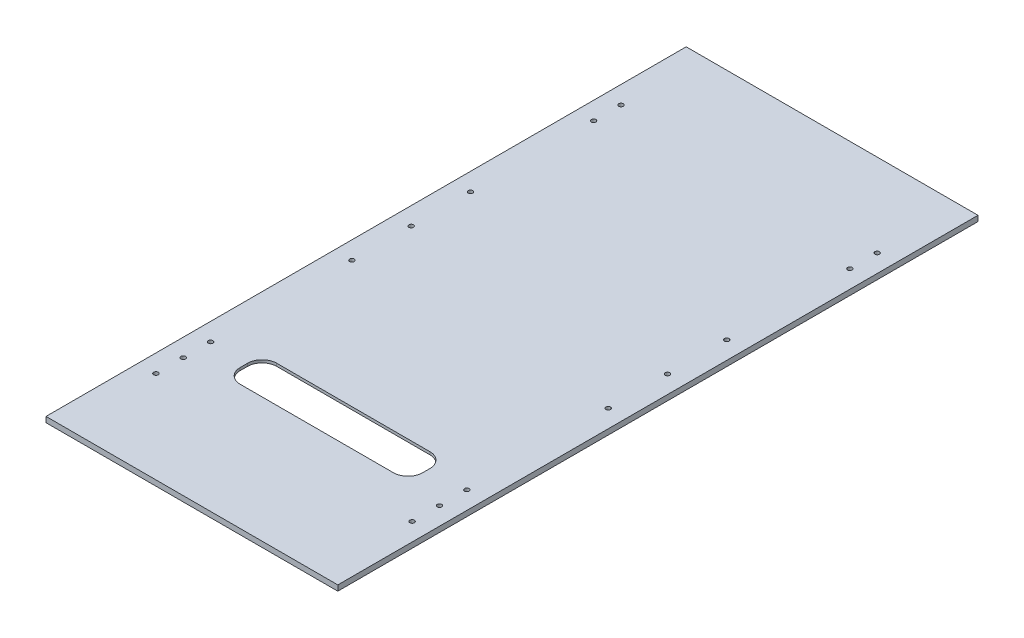
ISO-10303-21;
HEADER;
FILE_DESCRIPTION(('STEP AP214'),'2;1');
FILE_NAME('part.step','',(''),(''),'','','');
FILE_SCHEMA(('AUTOMOTIVE_DESIGN { 1 0 10303 214 1 1 1 1 }'));
ENDSEC;
DATA;
#1=APPLICATION_CONTEXT('core data for automotive mechanical design processes');
#2=APPLICATION_PROTOCOL_DEFINITION('international standard','automotive_design',2000,#1);
#3=PRODUCT_CONTEXT('',#1,'mechanical');
#4=PRODUCT('Part','Part','',(#3));
#5=PRODUCT_RELATED_PRODUCT_CATEGORY('part','',(#4));
#6=PRODUCT_DEFINITION_FORMATION('','',#4);
#7=PRODUCT_DEFINITION_CONTEXT('part definition',#1,'design');
#8=PRODUCT_DEFINITION('design','',#6,#7);
#9=PRODUCT_DEFINITION_SHAPE('','',#8);
#10=(LENGTH_UNIT() NAMED_UNIT(*) SI_UNIT(.MILLI.,.METRE.));
#11=(NAMED_UNIT(*) PLANE_ANGLE_UNIT() SI_UNIT($,.RADIAN.));
#12=(NAMED_UNIT(*) SI_UNIT($,.STERADIAN.) SOLID_ANGLE_UNIT());
#13=UNCERTAINTY_MEASURE_WITH_UNIT(LENGTH_MEASURE(1.E-05),#10,'distance_accuracy_value','');
#14=(GEOMETRIC_REPRESENTATION_CONTEXT(3) GLOBAL_UNCERTAINTY_ASSIGNED_CONTEXT((#13)) GLOBAL_UNIT_ASSIGNED_CONTEXT((#10,
#11,#12)) REPRESENTATION_CONTEXT('',''));
#15=CARTESIAN_POINT('',(0.,0.,0.));
#16=DIRECTION('',(0.,0.,1.));
#17=DIRECTION('',(1.,0.,0.));
#18=AXIS2_PLACEMENT_3D('',#15,#16,#17);
#19=CARTESIAN_POINT('',(80.,0.,223.5));
#20=DIRECTION('',(1.,0.,0.));
#21=DIRECTION('',(0.,0.,-1.));
#22=AXIS2_PLACEMENT_3D('',#19,#20,#21);
#23=PLANE('',#22);
#24=DIRECTION('',(0.,-1.,0.));
#25=VECTOR('',#24,1.);
#26=CARTESIAN_POINT('',(80.,-36.809382195833,175.5));
#27=LINE('',#26,#25);
#28=CARTESIAN_POINT('',(80.,57.,175.5));
#29=VERTEX_POINT('',#28);
#30=CARTESIAN_POINT('',(80.,54.,175.5));
#31=VERTEX_POINT('',#30);
#32=EDGE_CURVE('E491',#29,#31,#27,.T.);
#33=ORIENTED_EDGE('',*,*,#32,.T.);
#34=DIRECTION('',(0.,0.,1.));
#35=VECTOR('',#34,1.);
#36=CARTESIAN_POINT('',(80.,54.,81.));
#37=LINE('',#36,#35);
#38=CARTESIAN_POINT('',(80.,54.,-175.5));
#39=VERTEX_POINT('',#38);
#40=EDGE_CURVE('E189',#39,#31,#37,.T.);
#41=ORIENTED_EDGE('',*,*,#40,.F.);
#42=DIRECTION('',(0.,-1.,0.));
#43=VECTOR('',#42,1.);
#44=CARTESIAN_POINT('',(80.,0.,-175.5));
#45=LINE('',#44,#43);
#46=CARTESIAN_POINT('',(80.,57.,-175.5));
#47=VERTEX_POINT('',#46);
#48=EDGE_CURVE('E182',#47,#39,#45,.T.);
#49=ORIENTED_EDGE('',*,*,#48,.F.);
#50=DIRECTION('',(0.,0.,-1.));
#51=VECTOR('',#50,1.);
#52=CARTESIAN_POINT('',(80.,57.,140.));
#53=LINE('',#52,#51);
#54=EDGE_CURVE('E186',#29,#47,#53,.T.);
#55=ORIENTED_EDGE('',*,*,#54,.F.);
#56=EDGE_LOOP('',(#33,#41,#49,#55));
#57=FACE_BOUND('',#56,.T.);
#58=ADVANCED_FACE('F43',(#57),#23,.T.);
#59=CARTESIAN_POINT('',(-80.,0.,223.5));
#60=DIRECTION('',(1.,0.,0.));
#61=DIRECTION('',(0.,0.,-1.));
#62=AXIS2_PLACEMENT_3D('',#59,#60,#61);
#63=PLANE('',#62);
#64=DIRECTION('',(0.,0.,-1.));
#65=VECTOR('',#64,1.);
#66=CARTESIAN_POINT('',(-80.,57.,140.));
#67=LINE('',#66,#65);
#68=CARTESIAN_POINT('',(-80.,57.,175.5));
#69=VERTEX_POINT('',#68);
#70=CARTESIAN_POINT('',(-80.,57.,-175.5));
#71=VERTEX_POINT('',#70);
#72=EDGE_CURVE('E160',#69,#71,#67,.T.);
#73=ORIENTED_EDGE('',*,*,#72,.T.);
#74=DIRECTION('',(0.,-1.,0.));
#75=VECTOR('',#74,1.);
#76=CARTESIAN_POINT('',(-80.,0.,-175.5));
#77=LINE('',#76,#75);
#78=CARTESIAN_POINT('',(-80.,54.,-175.5));
#79=VERTEX_POINT('',#78);
#80=EDGE_CURVE('E163',#71,#79,#77,.T.);
#81=ORIENTED_EDGE('',*,*,#80,.T.);
#82=DIRECTION('',(0.,0.,1.));
#83=VECTOR('',#82,1.);
#84=CARTESIAN_POINT('',(-80.,54.,81.));
#85=LINE('',#84,#83);
#86=CARTESIAN_POINT('',(-80.,54.,175.5));
#87=VERTEX_POINT('',#86);
#88=EDGE_CURVE('E173',#79,#87,#85,.T.);
#89=ORIENTED_EDGE('',*,*,#88,.T.);
#90=DIRECTION('',(0.,-1.,0.));
#91=VECTOR('',#90,1.);
#92=CARTESIAN_POINT('',(-80.,-36.809382195833,175.5));
#93=LINE('',#92,#91);
#94=EDGE_CURVE('E166',#69,#87,#93,.T.);
#95=ORIENTED_EDGE('',*,*,#94,.F.);
#96=EDGE_LOOP('',(#73,#81,#89,#95));
#97=FACE_BOUND('',#96,.T.);
#98=ADVANCED_FACE('F162',(#97),#63,.F.);
#99=CARTESIAN_POINT('',(-60.5,-85.9125199474914,72.));
#100=DIRECTION('',(0.,0.,1.));
#101=DIRECTION('',(1.,0.,0.));
#102=AXIS2_PLACEMENT_3D('',#99,#100,#101);
#103=PLANE('',#102);
#104=DIRECTION('',(0.,1.,0.));
#105=VECTOR('',#104,1.);
#106=CARTESIAN_POINT('',(-60.5,-85.9125199474914,72.));
#107=LINE('',#106,#105);
#108=CARTESIAN_POINT('',(-60.5,54.,72.));
#109=VERTEX_POINT('',#108);
#110=CARTESIAN_POINT('',(-60.5,55.5,72.));
#111=VERTEX_POINT('',#110);
#112=EDGE_CURVE('E467',#109,#111,#107,.T.);
#113=ORIENTED_EDGE('',*,*,#112,.F.);
#114=DIRECTION('',(1.,0.,0.));
#115=VECTOR('',#114,1.);
#116=CARTESIAN_POINT('',(-60.5,54.,72.));
#117=LINE('',#116,#115);
#118=CARTESIAN_POINT('',(60.5,54.,72.));
#119=VERTEX_POINT('',#118);
#120=EDGE_CURVE('E61',#109,#119,#117,.T.);
#121=ORIENTED_EDGE('',*,*,#120,.T.);
#122=DIRECTION('',(0.,1.,0.));
#123=VECTOR('',#122,1.);
#124=CARTESIAN_POINT('',(60.5,-85.9125199474914,72.));
#125=LINE('',#124,#123);
#126=CARTESIAN_POINT('',(60.5,55.5,72.));
#127=VERTEX_POINT('',#126);
#128=EDGE_CURVE('E470',#119,#127,#125,.T.);
#129=ORIENTED_EDGE('',*,*,#128,.T.);
#130=DIRECTION('',(-1.,0.,0.));
#131=VECTOR('',#130,1.);
#132=CARTESIAN_POINT('',(60.5,55.5,72.));
#133=LINE('',#132,#131);
#134=EDGE_CURVE('E442',#127,#111,#133,.T.);
#135=ORIENTED_EDGE('',*,*,#134,.T.);
#136=EDGE_LOOP('',(#113,#121,#129,#135));
#137=FACE_BOUND('',#136,.T.);
#138=ADVANCED_FACE('F356',(#137),#103,.T.);
#139=CARTESIAN_POINT('',(60.5,47.,124.5));
#140=DIRECTION('',(0.,0.,-1.));
#141=DIRECTION('',(-1.,0.,0.));
#142=AXIS2_PLACEMENT_3D('',#139,#140,#141);
#143=PLANE('',#142);
#144=DIRECTION('',(0.,1.,0.));
#145=VECTOR('',#144,1.);
#146=CARTESIAN_POINT('',(60.5,47.,124.5));
#147=LINE('',#146,#145);
#148=CARTESIAN_POINT('',(60.5,54.,124.5));
#149=VERTEX_POINT('',#148);
#150=CARTESIAN_POINT('',(60.5,55.5,124.5));
#151=VERTEX_POINT('',#150);
#152=EDGE_CURVE('E464',#149,#151,#147,.T.);
#153=ORIENTED_EDGE('',*,*,#152,.F.);
#154=DIRECTION('',(-1.,0.,0.));
#155=VECTOR('',#154,1.);
#156=CARTESIAN_POINT('',(60.5,54.,124.5));
#157=LINE('',#156,#155);
#158=CARTESIAN_POINT('',(-60.5,54.,124.5));
#159=VERTEX_POINT('',#158);
#160=EDGE_CURVE('E524',#149,#159,#157,.T.);
#161=ORIENTED_EDGE('',*,*,#160,.T.);
#162=DIRECTION('',(0.,1.,0.));
#163=VECTOR('',#162,1.);
#164=CARTESIAN_POINT('',(-60.5,47.,124.5));
#165=LINE('',#164,#163);
#166=CARTESIAN_POINT('',(-60.5,55.5,124.5));
#167=VERTEX_POINT('',#166);
#168=EDGE_CURVE('E463',#159,#167,#165,.T.);
#169=ORIENTED_EDGE('',*,*,#168,.T.);
#170=DIRECTION('',(1.,0.,0.));
#171=VECTOR('',#170,1.);
#172=CARTESIAN_POINT('',(-60.5,55.5,124.5));
#173=LINE('',#172,#171);
#174=EDGE_CURVE('E455',#167,#151,#173,.T.);
#175=ORIENTED_EDGE('',*,*,#174,.T.);
#176=EDGE_LOOP('',(#153,#161,#169,#175));
#177=FACE_BOUND('',#176,.T.);
#178=ADVANCED_FACE('F384',(#177),#143,.T.);
#179=CARTESIAN_POINT('',(60.5,57.,140.));
#180=DIRECTION('',(1.,0.,0.));
#181=DIRECTION('',(0.,0.,-1.));
#182=AXIS2_PLACEMENT_3D('',#179,#180,#181);
#183=PLANE('',#182);
#184=DIRECTION('',(0.,0.,-1.));
#185=VECTOR('',#184,1.);
#186=CARTESIAN_POINT('',(60.5,54.,140.));
#187=LINE('',#186,#185);
#188=EDGE_CURVE('E493',#149,#119,#187,.T.);
#189=ORIENTED_EDGE('',*,*,#188,.F.);
#190=ORIENTED_EDGE('',*,*,#152,.T.);
#191=DIRECTION('',(0.,0.,-1.));
#192=VECTOR('',#191,1.);
#193=CARTESIAN_POINT('',(60.5,55.5,124.5));
#194=LINE('',#193,#192);
#195=EDGE_CURVE('E459',#151,#127,#194,.T.);
#196=ORIENTED_EDGE('',*,*,#195,.T.);
#197=ORIENTED_EDGE('',*,*,#128,.F.);
#198=EDGE_LOOP('',(#189,#190,#196,#197));
#199=FACE_BOUND('',#198,.T.);
#200=ADVANCED_FACE('F387',(#199),#183,.F.);
#201=CARTESIAN_POINT('',(115.999949632893,-36.809382195833,175.5));
#202=DIRECTION('',(0.,0.,-1.));
#203=DIRECTION('',(-1.,0.,0.));
#204=AXIS2_PLACEMENT_3D('',#201,#202,#203);
#205=PLANE('',#204);
#206=ORIENTED_EDGE('',*,*,#32,.F.);
#207=DIRECTION('',(-1.,0.,0.));
#208=VECTOR('',#207,1.);
#209=CARTESIAN_POINT('',(80.,57.,175.5));
#210=LINE('',#209,#208);
#211=EDGE_CURVE('E188',#29,#69,#210,.T.);
#212=ORIENTED_EDGE('',*,*,#211,.T.);
#213=ORIENTED_EDGE('',*,*,#94,.T.);
#214=DIRECTION('',(-1.,0.,0.));
#215=VECTOR('',#214,1.);
#216=CARTESIAN_POINT('',(80.,54.,175.5));
#217=LINE('',#216,#215);
#218=EDGE_CURVE('E195',#31,#87,#217,.T.);
#219=ORIENTED_EDGE('',*,*,#218,.F.);
#220=EDGE_LOOP('',(#206,#212,#213,#219));
#221=FACE_BOUND('',#220,.T.);
#222=ADVANCED_FACE('F399',(#221),#205,.F.);
#223=CARTESIAN_POINT('',(115.999949632893,-36.809382195833,-175.5));
#224=DIRECTION('',(0.,0.,1.));
#225=DIRECTION('',(-1.,0.,0.));
#226=AXIS2_PLACEMENT_3D('',#223,#224,#225);
#227=PLANE('',#226);
#228=ORIENTED_EDGE('',*,*,#48,.T.);
#229=DIRECTION('',(1.,0.,0.));
#230=VECTOR('',#229,1.);
#231=CARTESIAN_POINT('',(80.,54.,-175.5));
#232=LINE('',#231,#230);
#233=EDGE_CURVE('E172',#79,#39,#232,.T.);
#234=ORIENTED_EDGE('',*,*,#233,.F.);
#235=ORIENTED_EDGE('',*,*,#80,.F.);
#236=DIRECTION('',(-1.,0.,0.));
#237=VECTOR('',#236,1.);
#238=CARTESIAN_POINT('',(80.,57.,-175.5));
#239=LINE('',#238,#237);
#240=EDGE_CURVE('E179',#47,#71,#239,.T.);
#241=ORIENTED_EDGE('',*,*,#240,.F.);
#242=EDGE_LOOP('',(#228,#234,#235,#241));
#243=FACE_BOUND('',#242,.T.);
#244=ADVANCED_FACE('F178',(#243),#227,.F.);
#245=CARTESIAN_POINT('',(-60.5,57.,140.));
#246=DIRECTION('',(-1.,0.,0.));
#247=DIRECTION('',(0.,0.,-1.));
#248=AXIS2_PLACEMENT_3D('',#245,#246,#247);
#249=PLANE('',#248);
#250=DIRECTION('',(0.,0.,1.));
#251=VECTOR('',#250,1.);
#252=CARTESIAN_POINT('',(-60.5,54.,140.));
#253=LINE('',#252,#251);
#254=EDGE_CURVE('E519',#109,#159,#253,.T.);
#255=ORIENTED_EDGE('',*,*,#254,.F.);
#256=ORIENTED_EDGE('',*,*,#112,.T.);
#257=DIRECTION('',(0.,0.,1.));
#258=VECTOR('',#257,1.);
#259=CARTESIAN_POINT('',(-60.5,55.5,72.));
#260=LINE('',#259,#258);
#261=EDGE_CURVE('E451',#111,#167,#260,.T.);
#262=ORIENTED_EDGE('',*,*,#261,.T.);
#263=ORIENTED_EDGE('',*,*,#168,.F.);
#264=EDGE_LOOP('',(#255,#256,#262,#263));
#265=FACE_BOUND('',#264,.T.);
#266=ADVANCED_FACE('F382',(#265),#249,.F.);
#267=CARTESIAN_POINT('',(0.,55.5,0.));
#268=DIRECTION('',(0.,1.,0.));
#269=DIRECTION('',(0.,0.,1.));
#270=AXIS2_PLACEMENT_3D('',#267,#268,#269);
#271=PLANE('',#270);
#272=ORIENTED_EDGE('',*,*,#134,.F.);
#273=ORIENTED_EDGE('',*,*,#195,.F.);
#274=ORIENTED_EDGE('',*,*,#174,.F.);
#275=ORIENTED_EDGE('',*,*,#261,.F.);
#276=EDGE_LOOP('',(#272,#273,#274,#275));
#277=FACE_BOUND('',#276,.T.);
#278=DIRECTION('',(0.,0.,1.));
#279=VECTOR('',#278,1.);
#280=CARTESIAN_POINT('',(50.,55.5,87.));
#281=LINE('',#280,#279);
#282=CARTESIAN_POINT('',(50.,55.5,95.));
#283=VERTEX_POINT('',#282);
#284=CARTESIAN_POINT('',(50.,55.5,99.));
#285=VERTEX_POINT('',#284);
#286=EDGE_CURVE('E444',#283,#285,#281,.T.);
#287=ORIENTED_EDGE('',*,*,#286,.F.);
#288=CARTESIAN_POINT('',(42.,55.5,95.));
#289=DIRECTION('',(0.,1.,0.));
#290=DIRECTION('',(0.,0.,1.));
#291=AXIS2_PLACEMENT_3D('',#288,#289,#290);
#292=CIRCLE('',#291,8.);
#293=CARTESIAN_POINT('',(42.,55.5,87.));
#294=VERTEX_POINT('',#293);
#295=EDGE_CURVE('E248',#283,#294,#292,.T.);
#296=ORIENTED_EDGE('',*,*,#295,.T.);
#297=DIRECTION('',(1.,0.,0.));
#298=VECTOR('',#297,1.);
#299=CARTESIAN_POINT('',(-50.,55.5,87.));
#300=LINE('',#299,#298);
#301=CARTESIAN_POINT('',(-42.,55.5,87.));
#302=VERTEX_POINT('',#301);
#303=EDGE_CURVE('E436',#302,#294,#300,.T.);
#304=ORIENTED_EDGE('',*,*,#303,.F.);
#305=CARTESIAN_POINT('',(-42.,55.5,95.));
#306=DIRECTION('',(0.,1.,0.));
#307=DIRECTION('',(0.,0.,1.));
#308=AXIS2_PLACEMENT_3D('',#305,#306,#307);
#309=CIRCLE('',#308,8.);
#310=CARTESIAN_POINT('',(-50.,55.5,95.));
#311=VERTEX_POINT('',#310);
#312=EDGE_CURVE('E53',#302,#311,#309,.T.);
#313=ORIENTED_EDGE('',*,*,#312,.T.);
#314=DIRECTION('',(0.,0.,-1.));
#315=VECTOR('',#314,1.);
#316=CARTESIAN_POINT('',(-50.,55.5,87.));
#317=LINE('',#316,#315);
#318=CARTESIAN_POINT('',(-50.,55.5,99.));
#319=VERTEX_POINT('',#318);
#320=EDGE_CURVE('E429',#319,#311,#317,.T.);
#321=ORIENTED_EDGE('',*,*,#320,.F.);
#322=CARTESIAN_POINT('',(-42.,55.5,99.));
#323=DIRECTION('',(0.,1.,0.));
#324=DIRECTION('',(0.,0.,1.));
#325=AXIS2_PLACEMENT_3D('',#322,#323,#324);
#326=CIRCLE('',#325,8.);
#327=CARTESIAN_POINT('',(-42.,55.5,107.));
#328=VERTEX_POINT('',#327);
#329=EDGE_CURVE('E254',#319,#328,#326,.T.);
#330=ORIENTED_EDGE('',*,*,#329,.T.);
#331=DIRECTION('',(-1.,0.,0.));
#332=VECTOR('',#331,1.);
#333=CARTESIAN_POINT('',(-50.,55.5,107.));
#334=LINE('',#333,#332);
#335=CARTESIAN_POINT('',(42.,55.5,107.));
#336=VERTEX_POINT('',#335);
#337=EDGE_CURVE('E437',#336,#328,#334,.T.);
#338=ORIENTED_EDGE('',*,*,#337,.F.);
#339=CARTESIAN_POINT('',(42.,55.5,99.));
#340=DIRECTION('',(0.,1.,0.));
#341=DIRECTION('',(0.,0.,1.));
#342=AXIS2_PLACEMENT_3D('',#339,#340,#341);
#343=CIRCLE('',#342,8.);
#344=EDGE_CURVE('E242',#336,#285,#343,.T.);
#345=ORIENTED_EDGE('',*,*,#344,.T.);
#346=EDGE_LOOP('',(#287,#296,#304,#313,#321,#330,#338,#345));
#347=FACE_BOUND('',#346,.T.);
#348=ADVANCED_FACE('F379',(#277,#347),#271,.F.);
#349=CARTESIAN_POINT('',(60.5,57.,140.));
#350=DIRECTION('',(0.,-1.,0.));
#351=DIRECTION('',(0.,0.,-1.));
#352=AXIS2_PLACEMENT_3D('',#349,#350,#351);
#353=PLANE('',#352);
#354=CARTESIAN_POINT('',(70.25,57.,17.5000000000001));
#355=DIRECTION('',(0.,1.,0.));
#356=DIRECTION('',(0.,0.,-1.));
#357=AXIS2_PLACEMENT_3D('',#354,#355,#356);
#358=CIRCLE('',#357,1.25);
#359=CARTESIAN_POINT('',(70.25,57.,16.2500000000001));
#360=VERTEX_POINT('',#359);
#361=EDGE_CURVE('E550',#360,#360,#358,.T.);
#362=ORIENTED_EDGE('',*,*,#361,.F.);
#363=EDGE_LOOP('',(#362));
#364=FACE_BOUND('',#363,.T.);
#365=CARTESIAN_POINT('',(-70.25,57.,17.5000000000002));
#366=DIRECTION('',(0.,1.,0.));
#367=DIRECTION('',(0.,0.,1.));
#368=AXIS2_PLACEMENT_3D('',#365,#366,#367);
#369=CIRCLE('',#368,1.25);
#370=CARTESIAN_POINT('',(-70.25,57.,18.7500000000002));
#371=VERTEX_POINT('',#370);
#372=EDGE_CURVE('E553',#371,#371,#369,.T.);
#373=ORIENTED_EDGE('',*,*,#372,.F.);
#374=EDGE_LOOP('',(#373));
#375=FACE_BOUND('',#374,.T.);
#376=CARTESIAN_POINT('',(-70.25,57.,-14.9999999999995));
#377=DIRECTION('',(0.,1.,0.));
#378=DIRECTION('',(0.,0.,1.));
#379=AXIS2_PLACEMENT_3D('',#376,#377,#378);
#380=CIRCLE('',#379,1.25);
#381=CARTESIAN_POINT('',(-70.25,57.,-13.7499999999995));
#382=VERTEX_POINT('',#381);
#383=EDGE_CURVE('E558',#382,#382,#380,.T.);
#384=ORIENTED_EDGE('',*,*,#383,.F.);
#385=EDGE_LOOP('',(#384));
#386=FACE_BOUND('',#385,.T.);
#387=CARTESIAN_POINT('',(-70.25,57.,-47.4999999999993));
#388=DIRECTION('',(0.,1.,0.));
#389=DIRECTION('',(0.,0.,1.));
#390=AXIS2_PLACEMENT_3D('',#387,#388,#389);
#391=CIRCLE('',#390,1.25);
#392=CARTESIAN_POINT('',(-70.25,57.,-46.2499999999993));
#393=VERTEX_POINT('',#392);
#394=EDGE_CURVE('E539',#393,#393,#391,.T.);
#395=ORIENTED_EDGE('',*,*,#394,.F.);
#396=EDGE_LOOP('',(#395));
#397=FACE_BOUND('',#396,.T.);
#398=CARTESIAN_POINT('',(-70.25,57.,-115.));
#399=DIRECTION('',(0.,1.,0.));
#400=DIRECTION('',(0.,0.,1.));
#401=AXIS2_PLACEMENT_3D('',#398,#399,#400);
#402=CIRCLE('',#401,1.25);
#403=CARTESIAN_POINT('',(-70.25,57.,-113.75));
#404=VERTEX_POINT('',#403);
#405=EDGE_CURVE('E534',#404,#404,#402,.T.);
#406=ORIENTED_EDGE('',*,*,#405,.F.);
#407=EDGE_LOOP('',(#406));
#408=FACE_BOUND('',#407,.T.);
#409=CARTESIAN_POINT('',(-70.25,57.,-130.));
#410=DIRECTION('',(0.,1.,0.));
#411=DIRECTION('',(0.,0.,1.));
#412=AXIS2_PLACEMENT_3D('',#409,#410,#411);
#413=CIRCLE('',#412,1.25);
#414=CARTESIAN_POINT('',(-70.25,57.,-128.75));
#415=VERTEX_POINT('',#414);
#416=EDGE_CURVE('E538',#415,#415,#413,.T.);
#417=ORIENTED_EDGE('',*,*,#416,.F.);
#418=EDGE_LOOP('',(#417));
#419=FACE_BOUND('',#418,.T.);
#420=CARTESIAN_POINT('',(-70.25,57.,125.));
#421=DIRECTION('',(0.,1.,0.));
#422=DIRECTION('',(0.,0.,1.));
#423=AXIS2_PLACEMENT_3D('',#420,#421,#422);
#424=CIRCLE('',#423,1.25);
#425=CARTESIAN_POINT('',(-70.25,57.,126.25));
#426=VERTEX_POINT('',#425);
#427=EDGE_CURVE('E543',#426,#426,#424,.T.);
#428=ORIENTED_EDGE('',*,*,#427,.F.);
#429=EDGE_LOOP('',(#428));
#430=FACE_BOUND('',#429,.T.);
#431=CARTESIAN_POINT('',(-70.25,57.,110.));
#432=DIRECTION('',(0.,1.,0.));
#433=DIRECTION('',(0.,0.,1.));
#434=AXIS2_PLACEMENT_3D('',#431,#432,#433);
#435=CIRCLE('',#434,1.25);
#436=CARTESIAN_POINT('',(-70.25,57.,111.25));
#437=VERTEX_POINT('',#436);
#438=EDGE_CURVE('E533',#437,#437,#435,.T.);
#439=ORIENTED_EDGE('',*,*,#438,.F.);
#440=EDGE_LOOP('',(#439));
#441=FACE_BOUND('',#440,.T.);
#442=CARTESIAN_POINT('',(70.25,57.,-14.9999999999996));
#443=DIRECTION('',(0.,1.,0.));
#444=DIRECTION('',(0.,0.,-1.));
#445=AXIS2_PLACEMENT_3D('',#442,#443,#444);
#446=CIRCLE('',#445,1.25);
#447=CARTESIAN_POINT('',(70.25,57.,-16.2499999999996));
#448=VERTEX_POINT('',#447);
#449=EDGE_CURVE('E554',#448,#448,#446,.T.);
#450=ORIENTED_EDGE('',*,*,#449,.F.);
#451=EDGE_LOOP('',(#450));
#452=FACE_BOUND('',#451,.T.);
#453=CARTESIAN_POINT('',(70.25,57.,-47.4999999999994));
#454=DIRECTION('',(0.,1.,0.));
#455=DIRECTION('',(0.,0.,-1.));
#456=AXIS2_PLACEMENT_3D('',#453,#454,#455);
#457=CIRCLE('',#456,1.25);
#458=CARTESIAN_POINT('',(70.25,57.,-48.7499999999994));
#459=VERTEX_POINT('',#458);
#460=EDGE_CURVE('E585',#459,#459,#457,.T.);
#461=ORIENTED_EDGE('',*,*,#460,.F.);
#462=EDGE_LOOP('',(#461));
#463=FACE_BOUND('',#462,.T.);
#464=CARTESIAN_POINT('',(70.25,57.,-115.));
#465=DIRECTION('',(0.,1.,0.));
#466=DIRECTION('',(0.,0.,-1.));
#467=AXIS2_PLACEMENT_3D('',#464,#465,#466);
#468=CIRCLE('',#467,1.25);
#469=CARTESIAN_POINT('',(70.25,57.,-116.25));
#470=VERTEX_POINT('',#469);
#471=EDGE_CURVE('E581',#470,#470,#468,.T.);
#472=ORIENTED_EDGE('',*,*,#471,.F.);
#473=EDGE_LOOP('',(#472));
#474=FACE_BOUND('',#473,.T.);
#475=CARTESIAN_POINT('',(70.25,57.,-130.));
#476=DIRECTION('',(0.,1.,0.));
#477=DIRECTION('',(0.,0.,-1.));
#478=AXIS2_PLACEMENT_3D('',#475,#476,#477);
#479=CIRCLE('',#478,1.25);
#480=CARTESIAN_POINT('',(70.25,57.,-131.25));
#481=VERTEX_POINT('',#480);
#482=EDGE_CURVE('E577',#481,#481,#479,.T.);
#483=ORIENTED_EDGE('',*,*,#482,.F.);
#484=EDGE_LOOP('',(#483));
#485=FACE_BOUND('',#484,.T.);
#486=CARTESIAN_POINT('',(70.25,57.,125.));
#487=DIRECTION('',(0.,1.,0.));
#488=DIRECTION('',(0.,0.,-1.));
#489=AXIS2_PLACEMENT_3D('',#486,#487,#488);
#490=CIRCLE('',#489,1.25);
#491=CARTESIAN_POINT('',(70.25,57.,123.75));
#492=VERTEX_POINT('',#491);
#493=EDGE_CURVE('E573',#492,#492,#490,.T.);
#494=ORIENTED_EDGE('',*,*,#493,.F.);
#495=EDGE_LOOP('',(#494));
#496=FACE_BOUND('',#495,.T.);
#497=CARTESIAN_POINT('',(70.25,57.,110.));
#498=DIRECTION('',(0.,1.,0.));
#499=DIRECTION('',(0.,0.,-1.));
#500=AXIS2_PLACEMENT_3D('',#497,#498,#499);
#501=CIRCLE('',#500,1.25);
#502=CARTESIAN_POINT('',(70.25,57.,108.75));
#503=VERTEX_POINT('',#502);
#504=EDGE_CURVE('E569',#503,#503,#501,.T.);
#505=ORIENTED_EDGE('',*,*,#504,.F.);
#506=EDGE_LOOP('',(#505));
#507=FACE_BOUND('',#506,.T.);
#508=CARTESIAN_POINT('',(70.25,57.,94.9999999999998));
#509=DIRECTION('',(0.,1.,0.));
#510=DIRECTION('',(0.,0.,-1.));
#511=AXIS2_PLACEMENT_3D('',#508,#509,#510);
#512=CIRCLE('',#511,1.25);
#513=CARTESIAN_POINT('',(70.25,57.,93.7499999999998));
#514=VERTEX_POINT('',#513);
#515=EDGE_CURVE('E565',#514,#514,#512,.T.);
#516=ORIENTED_EDGE('',*,*,#515,.F.);
#517=EDGE_LOOP('',(#516));
#518=FACE_BOUND('',#517,.T.);
#519=CARTESIAN_POINT('',(-70.25,57.,95.));
#520=DIRECTION('',(0.,1.,0.));
#521=DIRECTION('',(0.,0.,1.));
#522=AXIS2_PLACEMENT_3D('',#519,#520,#521);
#523=CIRCLE('',#522,1.25);
#524=CARTESIAN_POINT('',(-70.25,57.,96.25));
#525=VERTEX_POINT('',#524);
#526=EDGE_CURVE('E275',#525,#525,#523,.T.);
#527=ORIENTED_EDGE('',*,*,#526,.F.);
#528=EDGE_LOOP('',(#527));
#529=FACE_BOUND('',#528,.T.);
#530=DIRECTION('',(0.,0.,-1.));
#531=VECTOR('',#530,1.);
#532=CARTESIAN_POINT('',(-50.,57.,140.));
#533=LINE('',#532,#531);
#534=CARTESIAN_POINT('',(-50.,57.,99.));
#535=VERTEX_POINT('',#534);
#536=CARTESIAN_POINT('',(-50.,57.,95.));
#537=VERTEX_POINT('',#536);
#538=EDGE_CURVE('E204',#535,#537,#533,.T.);
#539=ORIENTED_EDGE('',*,*,#538,.T.);
#540=CARTESIAN_POINT('',(-42.,57.,95.));
#541=DIRECTION('',(0.,-1.,0.));
#542=DIRECTION('',(0.,0.,-1.));
#543=AXIS2_PLACEMENT_3D('',#540,#541,#542);
#544=CIRCLE('',#543,8.);
#545=CARTESIAN_POINT('',(-42.,57.,87.));
#546=VERTEX_POINT('',#545);
#547=EDGE_CURVE('E11',#537,#546,#544,.T.);
#548=ORIENTED_EDGE('',*,*,#547,.T.);
#549=DIRECTION('',(1.,0.,0.));
#550=VECTOR('',#549,1.);
#551=CARTESIAN_POINT('',(60.5,57.,87.));
#552=LINE('',#551,#550);
#553=CARTESIAN_POINT('',(42.,57.,87.));
#554=VERTEX_POINT('',#553);
#555=EDGE_CURVE('E207',#546,#554,#552,.T.);
#556=ORIENTED_EDGE('',*,*,#555,.T.);
#557=CARTESIAN_POINT('',(42.,57.,95.));
#558=DIRECTION('',(0.,-1.,0.));
#559=DIRECTION('',(0.,0.,-1.));
#560=AXIS2_PLACEMENT_3D('',#557,#558,#559);
#561=CIRCLE('',#560,8.);
#562=CARTESIAN_POINT('',(50.,57.,95.));
#563=VERTEX_POINT('',#562);
#564=EDGE_CURVE('E251',#554,#563,#561,.T.);
#565=ORIENTED_EDGE('',*,*,#564,.T.);
#566=DIRECTION('',(0.,0.,1.));
#567=VECTOR('',#566,1.);
#568=CARTESIAN_POINT('',(50.,57.,140.));
#569=LINE('',#568,#567);
#570=CARTESIAN_POINT('',(50.,57.,99.));
#571=VERTEX_POINT('',#570);
#572=EDGE_CURVE('E211',#563,#571,#569,.T.);
#573=ORIENTED_EDGE('',*,*,#572,.T.);
#574=CARTESIAN_POINT('',(42.,57.,99.));
#575=DIRECTION('',(0.,-1.,0.));
#576=DIRECTION('',(0.,0.,-1.));
#577=AXIS2_PLACEMENT_3D('',#574,#575,#576);
#578=CIRCLE('',#577,8.);
#579=CARTESIAN_POINT('',(42.,57.,107.));
#580=VERTEX_POINT('',#579);
#581=EDGE_CURVE('E245',#571,#580,#578,.T.);
#582=ORIENTED_EDGE('',*,*,#581,.T.);
#583=DIRECTION('',(-1.,0.,0.));
#584=VECTOR('',#583,1.);
#585=CARTESIAN_POINT('',(60.5,57.,107.));
#586=LINE('',#585,#584);
#587=CARTESIAN_POINT('',(-42.,57.,107.));
#588=VERTEX_POINT('',#587);
#589=EDGE_CURVE('E200',#580,#588,#586,.T.);
#590=ORIENTED_EDGE('',*,*,#589,.T.);
#591=CARTESIAN_POINT('',(-42.,57.,99.));
#592=DIRECTION('',(0.,-1.,0.));
#593=DIRECTION('',(0.,0.,-1.));
#594=AXIS2_PLACEMENT_3D('',#591,#592,#593);
#595=CIRCLE('',#594,8.);
#596=EDGE_CURVE('E257',#588,#535,#595,.T.);
#597=ORIENTED_EDGE('',*,*,#596,.T.);
#598=EDGE_LOOP('',(#539,#548,#556,#565,#573,#582,#590,#597));
#599=FACE_BOUND('',#598,.T.);
#600=ORIENTED_EDGE('',*,*,#240,.T.);
#601=ORIENTED_EDGE('',*,*,#72,.F.);
#602=ORIENTED_EDGE('',*,*,#211,.F.);
#603=ORIENTED_EDGE('',*,*,#54,.T.);
#604=EDGE_LOOP('',(#600,#601,#602,#603));
#605=FACE_BOUND('',#604,.T.);
#606=ADVANCED_FACE('F185',(#364,#375,#386,#397,#408,#419,#430,#441,#452,#463,#474,#485,#496,
#507,#518,#529,#599,#605),#353,.F.);
#607=CARTESIAN_POINT('',(80.,54.,-109.));
#608=DIRECTION('',(0.,1.,0.));
#609=DIRECTION('',(0.,0.,1.));
#610=AXIS2_PLACEMENT_3D('',#607,#608,#609);
#611=PLANE('',#610);
#612=CARTESIAN_POINT('',(70.25,54.,17.5000000000001));
#613=DIRECTION('',(0.,1.,0.));
#614=DIRECTION('',(0.,0.,1.));
#615=AXIS2_PLACEMENT_3D('',#612,#613,#614);
#616=CIRCLE('',#615,1.25);
#617=CARTESIAN_POINT('',(70.25,54.,18.7500000000001));
#618=VERTEX_POINT('',#617);
#619=EDGE_CURVE('E47',#618,#618,#616,.T.);
#620=ORIENTED_EDGE('',*,*,#619,.T.);
#621=EDGE_LOOP('',(#620));
#622=FACE_BOUND('',#621,.T.);
#623=CARTESIAN_POINT('',(-70.25,54.,17.5000000000002));
#624=DIRECTION('',(0.,1.,0.));
#625=DIRECTION('',(0.,0.,1.));
#626=AXIS2_PLACEMENT_3D('',#623,#624,#625);
#627=CIRCLE('',#626,1.25);
#628=CARTESIAN_POINT('',(-70.25,54.,18.7500000000002));
#629=VERTEX_POINT('',#628);
#630=EDGE_CURVE('E326',#629,#629,#627,.T.);
#631=ORIENTED_EDGE('',*,*,#630,.T.);
#632=EDGE_LOOP('',(#631));
#633=FACE_BOUND('',#632,.T.);
#634=CARTESIAN_POINT('',(-70.25,54.,-14.9999999999995));
#635=DIRECTION('',(0.,1.,0.));
#636=DIRECTION('',(0.,0.,1.));
#637=AXIS2_PLACEMENT_3D('',#634,#635,#636);
#638=CIRCLE('',#637,1.25);
#639=CARTESIAN_POINT('',(-70.25,54.,-13.7499999999995));
#640=VERTEX_POINT('',#639);
#641=EDGE_CURVE('E323',#640,#640,#638,.T.);
#642=ORIENTED_EDGE('',*,*,#641,.T.);
#643=EDGE_LOOP('',(#642));
#644=FACE_BOUND('',#643,.T.);
#645=CARTESIAN_POINT('',(-70.25,54.,-47.4999999999993));
#646=DIRECTION('',(0.,1.,0.));
#647=DIRECTION('',(0.,0.,1.));
#648=AXIS2_PLACEMENT_3D('',#645,#646,#647);
#649=CIRCLE('',#648,1.25);
#650=CARTESIAN_POINT('',(-70.25,54.,-46.2499999999993));
#651=VERTEX_POINT('',#650);
#652=EDGE_CURVE('E319',#651,#651,#649,.T.);
#653=ORIENTED_EDGE('',*,*,#652,.T.);
#654=EDGE_LOOP('',(#653));
#655=FACE_BOUND('',#654,.T.);
#656=CARTESIAN_POINT('',(-70.25,54.,-115.));
#657=DIRECTION('',(0.,1.,0.));
#658=DIRECTION('',(0.,0.,1.));
#659=AXIS2_PLACEMENT_3D('',#656,#657,#658);
#660=CIRCLE('',#659,1.25);
#661=CARTESIAN_POINT('',(-70.25,54.,-113.75));
#662=VERTEX_POINT('',#661);
#663=EDGE_CURVE('E315',#662,#662,#660,.T.);
#664=ORIENTED_EDGE('',*,*,#663,.T.);
#665=EDGE_LOOP('',(#664));
#666=FACE_BOUND('',#665,.T.);
#667=CARTESIAN_POINT('',(-70.25,54.,-130.));
#668=DIRECTION('',(0.,1.,0.));
#669=DIRECTION('',(0.,0.,1.));
#670=AXIS2_PLACEMENT_3D('',#667,#668,#669);
#671=CIRCLE('',#670,1.25);
#672=CARTESIAN_POINT('',(-70.25,54.,-128.75));
#673=VERTEX_POINT('',#672);
#674=EDGE_CURVE('E311',#673,#673,#671,.T.);
#675=ORIENTED_EDGE('',*,*,#674,.T.);
#676=EDGE_LOOP('',(#675));
#677=FACE_BOUND('',#676,.T.);
#678=CARTESIAN_POINT('',(-70.25,54.,125.));
#679=DIRECTION('',(0.,1.,0.));
#680=DIRECTION('',(0.,0.,1.));
#681=AXIS2_PLACEMENT_3D('',#678,#679,#680);
#682=CIRCLE('',#681,1.25);
#683=CARTESIAN_POINT('',(-70.25,54.,126.25));
#684=VERTEX_POINT('',#683);
#685=EDGE_CURVE('E307',#684,#684,#682,.T.);
#686=ORIENTED_EDGE('',*,*,#685,.T.);
#687=EDGE_LOOP('',(#686));
#688=FACE_BOUND('',#687,.T.);
#689=CARTESIAN_POINT('',(-70.25,54.,110.));
#690=DIRECTION('',(0.,1.,0.));
#691=DIRECTION('',(0.,0.,1.));
#692=AXIS2_PLACEMENT_3D('',#689,#690,#691);
#693=CIRCLE('',#692,1.25);
#694=CARTESIAN_POINT('',(-70.25,54.,111.25));
#695=VERTEX_POINT('',#694);
#696=EDGE_CURVE('E303',#695,#695,#693,.T.);
#697=ORIENTED_EDGE('',*,*,#696,.T.);
#698=EDGE_LOOP('',(#697));
#699=FACE_BOUND('',#698,.T.);
#700=CARTESIAN_POINT('',(70.25,54.,-14.9999999999996));
#701=DIRECTION('',(0.,1.,0.));
#702=DIRECTION('',(0.,0.,1.));
#703=AXIS2_PLACEMENT_3D('',#700,#701,#702);
#704=CIRCLE('',#703,1.25);
#705=CARTESIAN_POINT('',(70.25,54.,-13.7499999999996));
#706=VERTEX_POINT('',#705);
#707=EDGE_CURVE('E299',#706,#706,#704,.T.);
#708=ORIENTED_EDGE('',*,*,#707,.T.);
#709=EDGE_LOOP('',(#708));
#710=FACE_BOUND('',#709,.T.);
#711=CARTESIAN_POINT('',(70.25,54.,-47.4999999999994));
#712=DIRECTION('',(0.,1.,0.));
#713=DIRECTION('',(0.,0.,1.));
#714=AXIS2_PLACEMENT_3D('',#711,#712,#713);
#715=CIRCLE('',#714,1.25);
#716=CARTESIAN_POINT('',(70.25,54.,-46.2499999999994));
#717=VERTEX_POINT('',#716);
#718=EDGE_CURVE('E295',#717,#717,#715,.T.);
#719=ORIENTED_EDGE('',*,*,#718,.T.);
#720=EDGE_LOOP('',(#719));
#721=FACE_BOUND('',#720,.T.);
#722=CARTESIAN_POINT('',(70.25,54.,-115.));
#723=DIRECTION('',(0.,1.,0.));
#724=DIRECTION('',(0.,0.,1.));
#725=AXIS2_PLACEMENT_3D('',#722,#723,#724);
#726=CIRCLE('',#725,1.25);
#727=CARTESIAN_POINT('',(70.25,54.,-113.75));
#728=VERTEX_POINT('',#727);
#729=EDGE_CURVE('E291',#728,#728,#726,.T.);
#730=ORIENTED_EDGE('',*,*,#729,.T.);
#731=EDGE_LOOP('',(#730));
#732=FACE_BOUND('',#731,.T.);
#733=CARTESIAN_POINT('',(70.25,54.,-130.));
#734=DIRECTION('',(0.,1.,0.));
#735=DIRECTION('',(0.,0.,1.));
#736=AXIS2_PLACEMENT_3D('',#733,#734,#735);
#737=CIRCLE('',#736,1.25);
#738=CARTESIAN_POINT('',(70.25,54.,-128.75));
#739=VERTEX_POINT('',#738);
#740=EDGE_CURVE('E287',#739,#739,#737,.T.);
#741=ORIENTED_EDGE('',*,*,#740,.T.);
#742=EDGE_LOOP('',(#741));
#743=FACE_BOUND('',#742,.T.);
#744=CARTESIAN_POINT('',(70.25,54.,125.));
#745=DIRECTION('',(0.,1.,0.));
#746=DIRECTION('',(0.,0.,1.));
#747=AXIS2_PLACEMENT_3D('',#744,#745,#746);
#748=CIRCLE('',#747,1.25);
#749=CARTESIAN_POINT('',(70.25,54.,126.25));
#750=VERTEX_POINT('',#749);
#751=EDGE_CURVE('E283',#750,#750,#748,.T.);
#752=ORIENTED_EDGE('',*,*,#751,.T.);
#753=EDGE_LOOP('',(#752));
#754=FACE_BOUND('',#753,.T.);
#755=CARTESIAN_POINT('',(70.25,54.,110.));
#756=DIRECTION('',(0.,1.,0.));
#757=DIRECTION('',(0.,0.,1.));
#758=AXIS2_PLACEMENT_3D('',#755,#756,#757);
#759=CIRCLE('',#758,1.25);
#760=CARTESIAN_POINT('',(70.25,54.,111.25));
#761=VERTEX_POINT('',#760);
#762=EDGE_CURVE('E279',#761,#761,#759,.T.);
#763=ORIENTED_EDGE('',*,*,#762,.T.);
#764=EDGE_LOOP('',(#763));
#765=FACE_BOUND('',#764,.T.);
#766=CARTESIAN_POINT('',(70.25,54.,94.9999999999998));
#767=DIRECTION('',(0.,1.,0.));
#768=DIRECTION('',(0.,0.,1.));
#769=AXIS2_PLACEMENT_3D('',#766,#767,#768);
#770=CIRCLE('',#769,1.25);
#771=CARTESIAN_POINT('',(70.25,54.,96.2499999999998));
#772=VERTEX_POINT('',#771);
#773=EDGE_CURVE('E274',#772,#772,#770,.T.);
#774=ORIENTED_EDGE('',*,*,#773,.T.);
#775=EDGE_LOOP('',(#774));
#776=FACE_BOUND('',#775,.T.);
#777=CARTESIAN_POINT('',(-70.25,54.,95.));
#778=DIRECTION('',(0.,1.,0.));
#779=DIRECTION('',(0.,0.,1.));
#780=AXIS2_PLACEMENT_3D('',#777,#778,#779);
#781=CIRCLE('',#780,1.25);
#782=CARTESIAN_POINT('',(-70.25,54.,96.25));
#783=VERTEX_POINT('',#782);
#784=EDGE_CURVE('E270',#783,#783,#781,.T.);
#785=ORIENTED_EDGE('',*,*,#784,.T.);
#786=EDGE_LOOP('',(#785));
#787=FACE_BOUND('',#786,.T.);
#788=ORIENTED_EDGE('',*,*,#233,.T.);
#789=ORIENTED_EDGE('',*,*,#40,.T.);
#790=ORIENTED_EDGE('',*,*,#218,.T.);
#791=ORIENTED_EDGE('',*,*,#88,.F.);
#792=EDGE_LOOP('',(#788,#789,#790,#791));
#793=FACE_BOUND('',#792,.T.);
#794=ORIENTED_EDGE('',*,*,#188,.T.);
#795=ORIENTED_EDGE('',*,*,#120,.F.);
#796=ORIENTED_EDGE('',*,*,#254,.T.);
#797=ORIENTED_EDGE('',*,*,#160,.F.);
#798=EDGE_LOOP('',(#794,#795,#796,#797));
#799=FACE_BOUND('',#798,.T.);
#800=ADVANCED_FACE('F335',(#622,#633,#644,#655,#666,#677,#688,#699,#710,#721,#732,#743,#754,
#765,#776,#787,#793,#799),#611,.F.);
#801=CARTESIAN_POINT('',(50.,65.5,87.));
#802=DIRECTION('',(1.,0.,0.));
#803=DIRECTION('',(0.,0.,-1.));
#804=AXIS2_PLACEMENT_3D('',#801,#802,#803);
#805=PLANE('',#804);
#806=ORIENTED_EDGE('',*,*,#286,.T.);
#807=DIRECTION('',(0.,-1.,0.));
#808=VECTOR('',#807,1.);
#809=CARTESIAN_POINT('',(50.,57.,99.));
#810=LINE('',#809,#808);
#811=EDGE_CURVE('E226',#285,#571,#810,.F.);
#812=ORIENTED_EDGE('',*,*,#811,.T.);
#813=ORIENTED_EDGE('',*,*,#572,.F.);
#814=DIRECTION('',(0.,-1.,0.));
#815=VECTOR('',#814,1.);
#816=CARTESIAN_POINT('',(50.,55.5,95.));
#817=LINE('',#816,#815);
#818=EDGE_CURVE('E222',#563,#283,#817,.T.);
#819=ORIENTED_EDGE('',*,*,#818,.T.);
#820=EDGE_LOOP('',(#806,#812,#813,#819));
#821=FACE_BOUND('',#820,.T.);
#822=ADVANCED_FACE('F367',(#821),#805,.F.);
#823=CARTESIAN_POINT('',(-50.,65.5,87.));
#824=DIRECTION('',(0.,0.,-1.));
#825=DIRECTION('',(-1.,0.,0.));
#826=AXIS2_PLACEMENT_3D('',#823,#824,#825);
#827=PLANE('',#826);
#828=ORIENTED_EDGE('',*,*,#303,.T.);
#829=DIRECTION('',(0.,-1.,0.));
#830=VECTOR('',#829,1.);
#831=CARTESIAN_POINT('',(42.,57.,87.));
#832=LINE('',#831,#830);
#833=EDGE_CURVE('E233',#294,#554,#832,.F.);
#834=ORIENTED_EDGE('',*,*,#833,.T.);
#835=ORIENTED_EDGE('',*,*,#555,.F.);
#836=DIRECTION('',(0.,-1.,0.));
#837=VECTOR('',#836,1.);
#838=CARTESIAN_POINT('',(-42.,55.5,87.));
#839=LINE('',#838,#837);
#840=EDGE_CURVE('E229',#546,#302,#839,.T.);
#841=ORIENTED_EDGE('',*,*,#840,.T.);
#842=EDGE_LOOP('',(#828,#834,#835,#841));
#843=FACE_BOUND('',#842,.T.);
#844=ADVANCED_FACE('F363',(#843),#827,.F.);
#845=CARTESIAN_POINT('',(-50.,65.5,87.));
#846=DIRECTION('',(-1.,0.,0.));
#847=DIRECTION('',(0.,0.,1.));
#848=AXIS2_PLACEMENT_3D('',#845,#846,#847);
#849=PLANE('',#848);
#850=ORIENTED_EDGE('',*,*,#538,.F.);
#851=DIRECTION('',(0.,-1.,0.));
#852=VECTOR('',#851,1.);
#853=CARTESIAN_POINT('',(-50.,55.5,99.));
#854=LINE('',#853,#852);
#855=EDGE_CURVE('E238',#535,#319,#854,.T.);
#856=ORIENTED_EDGE('',*,*,#855,.T.);
#857=ORIENTED_EDGE('',*,*,#320,.T.);
#858=DIRECTION('',(0.,-1.,0.));
#859=VECTOR('',#858,1.);
#860=CARTESIAN_POINT('',(-50.,57.,95.));
#861=LINE('',#860,#859);
#862=EDGE_CURVE('E69',#311,#537,#861,.F.);
#863=ORIENTED_EDGE('',*,*,#862,.T.);
#864=EDGE_LOOP('',(#850,#856,#857,#863));
#865=FACE_BOUND('',#864,.T.);
#866=ADVANCED_FACE('F366',(#865),#849,.F.);
#867=CARTESIAN_POINT('',(-50.,65.5,107.));
#868=DIRECTION('',(0.,0.,1.));
#869=DIRECTION('',(1.,0.,0.));
#870=AXIS2_PLACEMENT_3D('',#867,#868,#869);
#871=PLANE('',#870);
#872=ORIENTED_EDGE('',*,*,#589,.F.);
#873=DIRECTION('',(0.,-1.,0.));
#874=VECTOR('',#873,1.);
#875=CARTESIAN_POINT('',(42.,55.5,107.));
#876=LINE('',#875,#874);
#877=EDGE_CURVE('E218',#580,#336,#876,.T.);
#878=ORIENTED_EDGE('',*,*,#877,.T.);
#879=ORIENTED_EDGE('',*,*,#337,.T.);
#880=DIRECTION('',(0.,-1.,0.));
#881=VECTOR('',#880,1.);
#882=CARTESIAN_POINT('',(-42.,57.,107.));
#883=LINE('',#882,#881);
#884=EDGE_CURVE('E215',#328,#588,#883,.F.);
#885=ORIENTED_EDGE('',*,*,#884,.T.);
#886=EDGE_LOOP('',(#872,#878,#879,#885));
#887=FACE_BOUND('',#886,.T.);
#888=ADVANCED_FACE('F371',(#887),#871,.F.);
#889=CARTESIAN_POINT('',(42.,65.5,99.));
#890=DIRECTION('',(0.,1.,0.));
#891=DIRECTION('',(0.,0.,1.));
#892=AXIS2_PLACEMENT_3D('',#889,#890,#891);
#893=CYLINDRICAL_SURFACE('',#892,8.);
#894=ORIENTED_EDGE('',*,*,#581,.F.);
#895=ORIENTED_EDGE('',*,*,#811,.F.);
#896=ORIENTED_EDGE('',*,*,#344,.F.);
#897=ORIENTED_EDGE('',*,*,#877,.F.);
#898=EDGE_LOOP('',(#894,#895,#896,#897));
#899=FACE_BOUND('',#898,.T.);
#900=ADVANCED_FACE('F374',(#899),#893,.F.);
#901=CARTESIAN_POINT('',(42.,65.5,95.));
#902=DIRECTION('',(0.,1.,0.));
#903=DIRECTION('',(0.,0.,1.));
#904=AXIS2_PLACEMENT_3D('',#901,#902,#903);
#905=CYLINDRICAL_SURFACE('',#904,8.);
#906=ORIENTED_EDGE('',*,*,#564,.F.);
#907=ORIENTED_EDGE('',*,*,#833,.F.);
#908=ORIENTED_EDGE('',*,*,#295,.F.);
#909=ORIENTED_EDGE('',*,*,#818,.F.);
#910=EDGE_LOOP('',(#906,#907,#908,#909));
#911=FACE_BOUND('',#910,.T.);
#912=ADVANCED_FACE('F411',(#911),#905,.F.);
#913=CARTESIAN_POINT('',(-42.,65.5,99.));
#914=DIRECTION('',(0.,1.,0.));
#915=DIRECTION('',(0.,0.,1.));
#916=AXIS2_PLACEMENT_3D('',#913,#914,#915);
#917=CYLINDRICAL_SURFACE('',#916,8.);
#918=ORIENTED_EDGE('',*,*,#596,.F.);
#919=ORIENTED_EDGE('',*,*,#884,.F.);
#920=ORIENTED_EDGE('',*,*,#329,.F.);
#921=ORIENTED_EDGE('',*,*,#855,.F.);
#922=EDGE_LOOP('',(#918,#919,#920,#921));
#923=FACE_BOUND('',#922,.T.);
#924=ADVANCED_FACE('F414',(#923),#917,.F.);
#925=CARTESIAN_POINT('',(-42.,65.5,95.));
#926=DIRECTION('',(0.,1.,0.));
#927=DIRECTION('',(0.,0.,1.));
#928=AXIS2_PLACEMENT_3D('',#925,#926,#927);
#929=CYLINDRICAL_SURFACE('',#928,8.);
#930=ORIENTED_EDGE('',*,*,#547,.F.);
#931=ORIENTED_EDGE('',*,*,#862,.F.);
#932=ORIENTED_EDGE('',*,*,#312,.F.);
#933=ORIENTED_EDGE('',*,*,#840,.F.);
#934=EDGE_LOOP('',(#930,#931,#932,#933));
#935=FACE_BOUND('',#934,.T.);
#936=ADVANCED_FACE('F45',(#935),#929,.F.);
#937=CARTESIAN_POINT('',(-70.25,47.,95.));
#938=DIRECTION('',(0.,1.,0.));
#939=DIRECTION('',(0.,0.,1.));
#940=AXIS2_PLACEMENT_3D('',#937,#938,#939);
#941=CYLINDRICAL_SURFACE('',#940,1.25);
#942=ORIENTED_EDGE('',*,*,#526,.T.);
#943=EDGE_LOOP('',(#942));
#944=FACE_BOUND('',#943,.T.);
#945=ORIENTED_EDGE('',*,*,#784,.F.);
#946=EDGE_LOOP('',(#945));
#947=FACE_BOUND('',#946,.T.);
#948=ADVANCED_FACE('F360',(#944,#947),#941,.F.);
#949=CARTESIAN_POINT('',(70.25,47.,94.9999999999998));
#950=DIRECTION('',(0.,1.,0.));
#951=DIRECTION('',(0.,0.,1.));
#952=AXIS2_PLACEMENT_3D('',#949,#950,#951);
#953=CYLINDRICAL_SURFACE('',#952,1.25);
#954=ORIENTED_EDGE('',*,*,#515,.T.);
#955=EDGE_LOOP('',(#954));
#956=FACE_BOUND('',#955,.T.);
#957=ORIENTED_EDGE('',*,*,#773,.F.);
#958=EDGE_LOOP('',(#957));
#959=FACE_BOUND('',#958,.T.);
#960=ADVANCED_FACE('F613',(#956,#959),#953,.F.);
#961=CARTESIAN_POINT('',(70.25,47.,110.));
#962=DIRECTION('',(0.,1.,0.));
#963=DIRECTION('',(0.,0.,1.));
#964=AXIS2_PLACEMENT_3D('',#961,#962,#963);
#965=CYLINDRICAL_SURFACE('',#964,1.25);
#966=ORIENTED_EDGE('',*,*,#504,.T.);
#967=EDGE_LOOP('',(#966));
#968=FACE_BOUND('',#967,.T.);
#969=ORIENTED_EDGE('',*,*,#762,.F.);
#970=EDGE_LOOP('',(#969));
#971=FACE_BOUND('',#970,.T.);
#972=ADVANCED_FACE('F619',(#968,#971),#965,.F.);
#973=CARTESIAN_POINT('',(70.25,47.,125.));
#974=DIRECTION('',(0.,1.,0.));
#975=DIRECTION('',(0.,0.,1.));
#976=AXIS2_PLACEMENT_3D('',#973,#974,#975);
#977=CYLINDRICAL_SURFACE('',#976,1.25);
#978=ORIENTED_EDGE('',*,*,#493,.T.);
#979=EDGE_LOOP('',(#978));
#980=FACE_BOUND('',#979,.T.);
#981=ORIENTED_EDGE('',*,*,#751,.F.);
#982=EDGE_LOOP('',(#981));
#983=FACE_BOUND('',#982,.T.);
#984=ADVANCED_FACE('F625',(#980,#983),#977,.F.);
#985=CARTESIAN_POINT('',(70.25,47.,-130.));
#986=DIRECTION('',(0.,1.,0.));
#987=DIRECTION('',(0.,0.,1.));
#988=AXIS2_PLACEMENT_3D('',#985,#986,#987);
#989=CYLINDRICAL_SURFACE('',#988,1.25);
#990=ORIENTED_EDGE('',*,*,#482,.T.);
#991=EDGE_LOOP('',(#990));
#992=FACE_BOUND('',#991,.T.);
#993=ORIENTED_EDGE('',*,*,#740,.F.);
#994=EDGE_LOOP('',(#993));
#995=FACE_BOUND('',#994,.T.);
#996=ADVANCED_FACE('F671',(#992,#995),#989,.F.);
#997=CARTESIAN_POINT('',(70.25,47.,-115.));
#998=DIRECTION('',(0.,1.,0.));
#999=DIRECTION('',(0.,0.,1.));
#1000=AXIS2_PLACEMENT_3D('',#997,#998,#999);
#1001=CYLINDRICAL_SURFACE('',#1000,1.25);
#1002=ORIENTED_EDGE('',*,*,#471,.T.);
#1003=EDGE_LOOP('',(#1002));
#1004=FACE_BOUND('',#1003,.T.);
#1005=ORIENTED_EDGE('',*,*,#729,.F.);
#1006=EDGE_LOOP('',(#1005));
#1007=FACE_BOUND('',#1006,.T.);
#1008=ADVANCED_FACE('F676',(#1004,#1007),#1001,.F.);
#1009=CARTESIAN_POINT('',(70.25,47.,-47.4999999999994));
#1010=DIRECTION('',(0.,1.,0.));
#1011=DIRECTION('',(0.,0.,1.));
#1012=AXIS2_PLACEMENT_3D('',#1009,#1010,#1011);
#1013=CYLINDRICAL_SURFACE('',#1012,1.25);
#1014=ORIENTED_EDGE('',*,*,#460,.T.);
#1015=EDGE_LOOP('',(#1014));
#1016=FACE_BOUND('',#1015,.T.);
#1017=ORIENTED_EDGE('',*,*,#718,.F.);
#1018=EDGE_LOOP('',(#1017));
#1019=FACE_BOUND('',#1018,.T.);
#1020=ADVANCED_FACE('F682',(#1016,#1019),#1013,.F.);
#1021=CARTESIAN_POINT('',(70.25,47.,-14.9999999999996));
#1022=DIRECTION('',(0.,1.,0.));
#1023=DIRECTION('',(0.,0.,1.));
#1024=AXIS2_PLACEMENT_3D('',#1021,#1022,#1023);
#1025=CYLINDRICAL_SURFACE('',#1024,1.25);
#1026=ORIENTED_EDGE('',*,*,#449,.T.);
#1027=EDGE_LOOP('',(#1026));
#1028=FACE_BOUND('',#1027,.T.);
#1029=ORIENTED_EDGE('',*,*,#707,.F.);
#1030=EDGE_LOOP('',(#1029));
#1031=FACE_BOUND('',#1030,.T.);
#1032=ADVANCED_FACE('F593',(#1028,#1031),#1025,.F.);
#1033=CARTESIAN_POINT('',(-70.25,47.,110.));
#1034=DIRECTION('',(0.,1.,0.));
#1035=DIRECTION('',(0.,0.,1.));
#1036=AXIS2_PLACEMENT_3D('',#1033,#1034,#1035);
#1037=CYLINDRICAL_SURFACE('',#1036,1.25);
#1038=ORIENTED_EDGE('',*,*,#438,.T.);
#1039=EDGE_LOOP('',(#1038));
#1040=FACE_BOUND('',#1039,.T.);
#1041=ORIENTED_EDGE('',*,*,#696,.F.);
#1042=EDGE_LOOP('',(#1041));
#1043=FACE_BOUND('',#1042,.T.);
#1044=ADVANCED_FACE('F688',(#1040,#1043),#1037,.F.);
#1045=CARTESIAN_POINT('',(-70.25,47.,125.));
#1046=DIRECTION('',(0.,1.,0.));
#1047=DIRECTION('',(0.,0.,1.));
#1048=AXIS2_PLACEMENT_3D('',#1045,#1046,#1047);
#1049=CYLINDRICAL_SURFACE('',#1048,1.25);
#1050=ORIENTED_EDGE('',*,*,#427,.T.);
#1051=EDGE_LOOP('',(#1050));
#1052=FACE_BOUND('',#1051,.T.);
#1053=ORIENTED_EDGE('',*,*,#685,.F.);
#1054=EDGE_LOOP('',(#1053));
#1055=FACE_BOUND('',#1054,.T.);
#1056=ADVANCED_FACE('F692',(#1052,#1055),#1049,.F.);
#1057=CARTESIAN_POINT('',(-70.25,47.,-130.));
#1058=DIRECTION('',(0.,1.,0.));
#1059=DIRECTION('',(0.,0.,1.));
#1060=AXIS2_PLACEMENT_3D('',#1057,#1058,#1059);
#1061=CYLINDRICAL_SURFACE('',#1060,1.25);
#1062=ORIENTED_EDGE('',*,*,#416,.T.);
#1063=EDGE_LOOP('',(#1062));
#1064=FACE_BOUND('',#1063,.T.);
#1065=ORIENTED_EDGE('',*,*,#674,.F.);
#1066=EDGE_LOOP('',(#1065));
#1067=FACE_BOUND('',#1066,.T.);
#1068=ADVANCED_FACE('F697',(#1064,#1067),#1061,.F.);
#1069=CARTESIAN_POINT('',(-70.25,47.,-115.));
#1070=DIRECTION('',(0.,1.,0.));
#1071=DIRECTION('',(0.,0.,1.));
#1072=AXIS2_PLACEMENT_3D('',#1069,#1070,#1071);
#1073=CYLINDRICAL_SURFACE('',#1072,1.25);
#1074=ORIENTED_EDGE('',*,*,#405,.T.);
#1075=EDGE_LOOP('',(#1074));
#1076=FACE_BOUND('',#1075,.T.);
#1077=ORIENTED_EDGE('',*,*,#663,.F.);
#1078=EDGE_LOOP('',(#1077));
#1079=FACE_BOUND('',#1078,.T.);
#1080=ADVANCED_FACE('F634',(#1076,#1079),#1073,.F.);
#1081=CARTESIAN_POINT('',(-70.25,47.,-47.4999999999993));
#1082=DIRECTION('',(0.,1.,0.));
#1083=DIRECTION('',(0.,0.,1.));
#1084=AXIS2_PLACEMENT_3D('',#1081,#1082,#1083);
#1085=CYLINDRICAL_SURFACE('',#1084,1.25);
#1086=ORIENTED_EDGE('',*,*,#394,.T.);
#1087=EDGE_LOOP('',(#1086));
#1088=FACE_BOUND('',#1087,.T.);
#1089=ORIENTED_EDGE('',*,*,#652,.F.);
#1090=EDGE_LOOP('',(#1089));
#1091=FACE_BOUND('',#1090,.T.);
#1092=ADVANCED_FACE('F631',(#1088,#1091),#1085,.F.);
#1093=CARTESIAN_POINT('',(-70.25,47.,-14.9999999999995));
#1094=DIRECTION('',(0.,1.,0.));
#1095=DIRECTION('',(0.,0.,1.));
#1096=AXIS2_PLACEMENT_3D('',#1093,#1094,#1095);
#1097=CYLINDRICAL_SURFACE('',#1096,1.25);
#1098=ORIENTED_EDGE('',*,*,#383,.T.);
#1099=EDGE_LOOP('',(#1098));
#1100=FACE_BOUND('',#1099,.T.);
#1101=ORIENTED_EDGE('',*,*,#641,.F.);
#1102=EDGE_LOOP('',(#1101));
#1103=FACE_BOUND('',#1102,.T.);
#1104=ADVANCED_FACE('F345',(#1100,#1103),#1097,.F.);
#1105=CARTESIAN_POINT('',(-70.25,47.,17.5000000000002));
#1106=DIRECTION('',(0.,1.,0.));
#1107=DIRECTION('',(0.,0.,1.));
#1108=AXIS2_PLACEMENT_3D('',#1105,#1106,#1107);
#1109=CYLINDRICAL_SURFACE('',#1108,1.25);
#1110=ORIENTED_EDGE('',*,*,#372,.T.);
#1111=EDGE_LOOP('',(#1110));
#1112=FACE_BOUND('',#1111,.T.);
#1113=ORIENTED_EDGE('',*,*,#630,.F.);
#1114=EDGE_LOOP('',(#1113));
#1115=FACE_BOUND('',#1114,.T.);
#1116=ADVANCED_FACE('F339',(#1112,#1115),#1109,.F.);
#1117=CARTESIAN_POINT('',(70.25,47.,17.5000000000001));
#1118=DIRECTION('',(0.,1.,0.));
#1119=DIRECTION('',(0.,0.,1.));
#1120=AXIS2_PLACEMENT_3D('',#1117,#1118,#1119);
#1121=CYLINDRICAL_SURFACE('',#1120,1.25);
#1122=ORIENTED_EDGE('',*,*,#361,.T.);
#1123=EDGE_LOOP('',(#1122));
#1124=FACE_BOUND('',#1123,.T.);
#1125=ORIENTED_EDGE('',*,*,#619,.F.);
#1126=EDGE_LOOP('',(#1125));
#1127=FACE_BOUND('',#1126,.T.);
#1128=ADVANCED_FACE('F337',(#1124,#1127),#1121,.F.);
#1129=CLOSED_SHELL('',(#58,#98,#138,#178,#200,#222,#244,#266,#348,#606,#800,#822,#844,#866,#888,
#900,#912,#924,#936,#948,#960,#972,#984,#996,#1008,#1020,#1032,#1044,#1056,#1068,#1080,#1092,
#1104,#1116,#1128));
#1130=MANIFOLD_SOLID_BREP('B2',#1129);
#1131=ADVANCED_BREP_SHAPE_REPRESENTATION('',(#18,#1130),#14);
#1132=SHAPE_DEFINITION_REPRESENTATION(#9,#1131);
ENDSEC;
END-ISO-10303-21;
